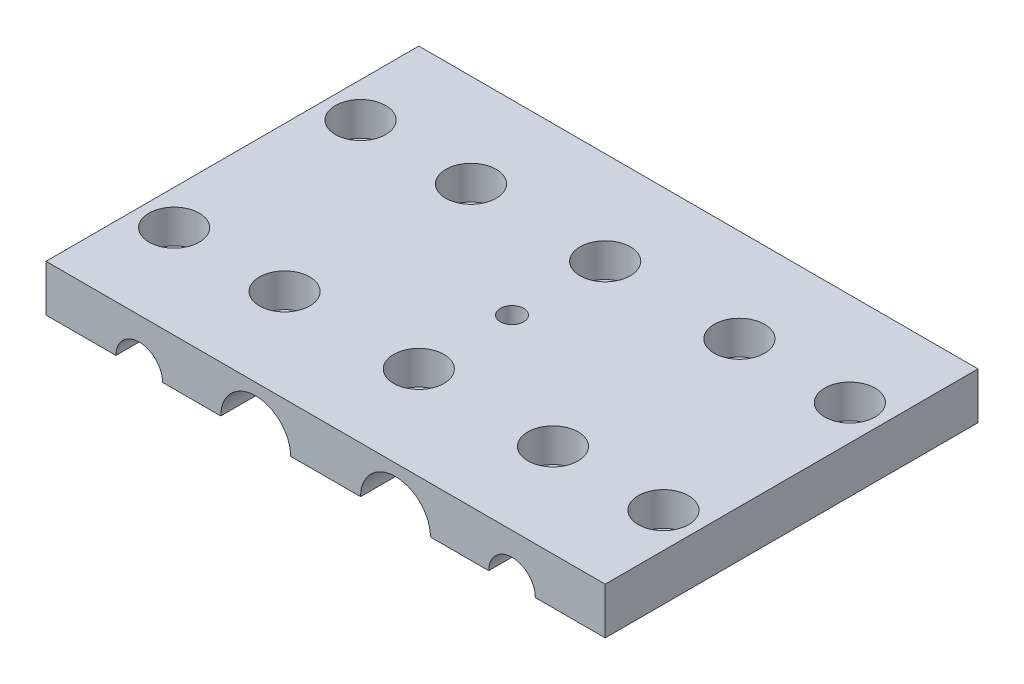
ISO-10303-21;
HEADER;
FILE_DESCRIPTION(('STEP AP214'),'2;1');
FILE_NAME('part.step','',(''),(''),'','','');
FILE_SCHEMA(('AUTOMOTIVE_DESIGN { 1 0 10303 214 1 1 1 1 }'));
ENDSEC;
DATA;
#1=APPLICATION_CONTEXT('core data for automotive mechanical design processes');
#2=APPLICATION_PROTOCOL_DEFINITION('international standard','automotive_design',2000,#1);
#3=PRODUCT_CONTEXT('',#1,'mechanical');
#4=PRODUCT('Part','Part','',(#3));
#5=PRODUCT_RELATED_PRODUCT_CATEGORY('part','',(#4));
#6=PRODUCT_DEFINITION_FORMATION('','',#4);
#7=PRODUCT_DEFINITION_CONTEXT('part definition',#1,'design');
#8=PRODUCT_DEFINITION('design','',#6,#7);
#9=PRODUCT_DEFINITION_SHAPE('','',#8);
#10=(LENGTH_UNIT() NAMED_UNIT(*) SI_UNIT(.MILLI.,.METRE.));
#11=(NAMED_UNIT(*) PLANE_ANGLE_UNIT() SI_UNIT($,.RADIAN.));
#12=(NAMED_UNIT(*) SI_UNIT($,.STERADIAN.) SOLID_ANGLE_UNIT());
#13=UNCERTAINTY_MEASURE_WITH_UNIT(LENGTH_MEASURE(1.E-05),#10,'distance_accuracy_value','');
#14=(GEOMETRIC_REPRESENTATION_CONTEXT(3) GLOBAL_UNCERTAINTY_ASSIGNED_CONTEXT((#13)) GLOBAL_UNIT_ASSIGNED_CONTEXT((#10,
#11,#12)) REPRESENTATION_CONTEXT('',''));
#15=CARTESIAN_POINT('',(0.,0.,0.));
#16=DIRECTION('',(0.,0.,1.));
#17=DIRECTION('',(1.,0.,0.));
#18=AXIS2_PLACEMENT_3D('',#15,#16,#17);
#19=CARTESIAN_POINT('',(-33.3375,6.35,12.7));
#20=DIRECTION('',(0.,1.,0.));
#21=DIRECTION('',(0.,0.,1.));
#22=AXIS2_PLACEMENT_3D('',#19,#20,#21);
#23=CYLINDRICAL_SURFACE('',#22,2.2479);
#24=CARTESIAN_POINT('',(-33.3375,0.,12.7));
#25=DIRECTION('',(0.,1.,0.));
#26=DIRECTION('',(0.,0.,1.));
#27=AXIS2_PLACEMENT_3D('',#24,#25,#26);
#28=CIRCLE('',#27,2.2479);
#29=CARTESIAN_POINT('',(-33.3375,0.,14.9479));
#30=VERTEX_POINT('',#29);
#31=EDGE_CURVE('E274',#30,#30,#28,.T.);
#32=ORIENTED_EDGE('',*,*,#31,.F.);
#33=EDGE_LOOP('',(#32));
#34=FACE_BOUND('',#33,.T.);
#35=CARTESIAN_POINT('',(-33.3375,1.778,12.7));
#36=DIRECTION('',(0.,1.,0.));
#37=DIRECTION('',(0.,0.,1.));
#38=AXIS2_PLACEMENT_3D('',#35,#36,#37);
#39=CIRCLE('',#38,2.2479);
#40=CARTESIAN_POINT('',(-33.3375,1.778,14.9479));
#41=VERTEX_POINT('',#40);
#42=EDGE_CURVE('E38',#41,#41,#39,.F.);
#43=ORIENTED_EDGE('',*,*,#42,.F.);
#44=EDGE_LOOP('',(#43));
#45=FACE_BOUND('',#44,.T.);
#46=ADVANCED_FACE('F34',(#34,#45),#23,.F.);
#47=CARTESIAN_POINT('',(-18.288,6.35,12.7));
#48=DIRECTION('',(0.,1.,0.));
#49=DIRECTION('',(0.,0.,1.));
#50=AXIS2_PLACEMENT_3D('',#47,#48,#49);
#51=CYLINDRICAL_SURFACE('',#50,2.2479);
#52=CARTESIAN_POINT('',(-18.288,0.,12.7));
#53=DIRECTION('',(0.,1.,0.));
#54=DIRECTION('',(0.,0.,1.));
#55=AXIS2_PLACEMENT_3D('',#52,#53,#54);
#56=CIRCLE('',#55,2.2479);
#57=CARTESIAN_POINT('',(-18.288,0.,14.9479));
#58=VERTEX_POINT('',#57);
#59=EDGE_CURVE('E277',#58,#58,#56,.T.);
#60=ORIENTED_EDGE('',*,*,#59,.F.);
#61=EDGE_LOOP('',(#60));
#62=FACE_BOUND('',#61,.T.);
#63=CARTESIAN_POINT('',(-18.288,1.778,12.7));
#64=DIRECTION('',(0.,1.,0.));
#65=DIRECTION('',(0.,0.,1.));
#66=AXIS2_PLACEMENT_3D('',#63,#64,#65);
#67=CIRCLE('',#66,2.2479);
#68=CARTESIAN_POINT('',(-18.288,1.778,14.9479));
#69=VERTEX_POINT('',#68);
#70=EDGE_CURVE('E223',#69,#69,#67,.F.);
#71=ORIENTED_EDGE('',*,*,#70,.F.);
#72=EDGE_LOOP('',(#71));
#73=FACE_BOUND('',#72,.T.);
#74=ADVANCED_FACE('F380',(#62,#73),#51,.F.);
#75=CARTESIAN_POINT('',(0.,6.35,12.7));
#76=DIRECTION('',(0.,1.,0.));
#77=DIRECTION('',(0.,0.,1.));
#78=AXIS2_PLACEMENT_3D('',#75,#76,#77);
#79=CYLINDRICAL_SURFACE('',#78,2.2479);
#80=CARTESIAN_POINT('',(0.,0.,12.7));
#81=DIRECTION('',(0.,1.,0.));
#82=DIRECTION('',(0.,0.,1.));
#83=AXIS2_PLACEMENT_3D('',#80,#81,#82);
#84=CIRCLE('',#83,2.2479);
#85=CARTESIAN_POINT('',(0.,0.,14.9479));
#86=VERTEX_POINT('',#85);
#87=EDGE_CURVE('E280',#86,#86,#84,.T.);
#88=ORIENTED_EDGE('',*,*,#87,.F.);
#89=EDGE_LOOP('',(#88));
#90=FACE_BOUND('',#89,.T.);
#91=CARTESIAN_POINT('',(0.,1.778,12.7));
#92=DIRECTION('',(0.,1.,0.));
#93=DIRECTION('',(0.,0.,1.));
#94=AXIS2_PLACEMENT_3D('',#91,#92,#93);
#95=CIRCLE('',#94,2.2479);
#96=CARTESIAN_POINT('',(0.,1.778,14.9479));
#97=VERTEX_POINT('',#96);
#98=EDGE_CURVE('E219',#97,#97,#95,.F.);
#99=ORIENTED_EDGE('',*,*,#98,.F.);
#100=EDGE_LOOP('',(#99));
#101=FACE_BOUND('',#100,.T.);
#102=ADVANCED_FACE('F386',(#90,#101),#79,.F.);
#103=CARTESIAN_POINT('',(18.288,6.35,12.7));
#104=DIRECTION('',(0.,1.,0.));
#105=DIRECTION('',(0.,0.,1.));
#106=AXIS2_PLACEMENT_3D('',#103,#104,#105);
#107=CYLINDRICAL_SURFACE('',#106,2.2479);
#108=CARTESIAN_POINT('',(18.288,0.,12.7));
#109=DIRECTION('',(0.,1.,0.));
#110=DIRECTION('',(0.,0.,1.));
#111=AXIS2_PLACEMENT_3D('',#108,#109,#110);
#112=CIRCLE('',#111,2.2479);
#113=CARTESIAN_POINT('',(18.288,0.,14.9479));
#114=VERTEX_POINT('',#113);
#115=EDGE_CURVE('E283',#114,#114,#112,.T.);
#116=ORIENTED_EDGE('',*,*,#115,.F.);
#117=EDGE_LOOP('',(#116));
#118=FACE_BOUND('',#117,.T.);
#119=CARTESIAN_POINT('',(18.288,1.778,12.7));
#120=DIRECTION('',(0.,1.,0.));
#121=DIRECTION('',(0.,0.,1.));
#122=AXIS2_PLACEMENT_3D('',#119,#120,#121);
#123=CIRCLE('',#122,2.2479);
#124=CARTESIAN_POINT('',(18.288,1.778,14.9479));
#125=VERTEX_POINT('',#124);
#126=EDGE_CURVE('E214',#125,#125,#123,.F.);
#127=ORIENTED_EDGE('',*,*,#126,.F.);
#128=EDGE_LOOP('',(#127));
#129=FACE_BOUND('',#128,.T.);
#130=ADVANCED_FACE('F397',(#118,#129),#107,.F.);
#131=CARTESIAN_POINT('',(33.3375,6.35,12.7));
#132=DIRECTION('',(0.,1.,0.));
#133=DIRECTION('',(0.,0.,1.));
#134=AXIS2_PLACEMENT_3D('',#131,#132,#133);
#135=CYLINDRICAL_SURFACE('',#134,2.2479);
#136=CARTESIAN_POINT('',(33.3375,0.,12.7));
#137=DIRECTION('',(0.,1.,0.));
#138=DIRECTION('',(0.,0.,1.));
#139=AXIS2_PLACEMENT_3D('',#136,#137,#138);
#140=CIRCLE('',#139,2.2479);
#141=CARTESIAN_POINT('',(33.3375,0.,14.9479));
#142=VERTEX_POINT('',#141);
#143=EDGE_CURVE('E286',#142,#142,#140,.T.);
#144=ORIENTED_EDGE('',*,*,#143,.F.);
#145=EDGE_LOOP('',(#144));
#146=FACE_BOUND('',#145,.T.);
#147=CARTESIAN_POINT('',(33.3375,1.778,12.7));
#148=DIRECTION('',(0.,1.,0.));
#149=DIRECTION('',(0.,0.,1.));
#150=AXIS2_PLACEMENT_3D('',#147,#148,#149);
#151=CIRCLE('',#150,2.2479);
#152=CARTESIAN_POINT('',(33.3375,1.778,14.9479));
#153=VERTEX_POINT('',#152);
#154=EDGE_CURVE('E209',#153,#153,#151,.F.);
#155=ORIENTED_EDGE('',*,*,#154,.F.);
#156=EDGE_LOOP('',(#155));
#157=FACE_BOUND('',#156,.T.);
#158=ADVANCED_FACE('F401',(#146,#157),#135,.F.);
#159=CARTESIAN_POINT('',(33.3375,6.35,-12.7));
#160=DIRECTION('',(0.,1.,0.));
#161=DIRECTION('',(0.,0.,1.));
#162=AXIS2_PLACEMENT_3D('',#159,#160,#161);
#163=CYLINDRICAL_SURFACE('',#162,2.2479);
#164=CARTESIAN_POINT('',(33.3375,0.,-12.7));
#165=DIRECTION('',(0.,1.,0.));
#166=DIRECTION('',(0.,0.,1.));
#167=AXIS2_PLACEMENT_3D('',#164,#165,#166);
#168=CIRCLE('',#167,2.2479);
#169=CARTESIAN_POINT('',(33.3375,0.,-10.4521));
#170=VERTEX_POINT('',#169);
#171=EDGE_CURVE('E289',#170,#170,#168,.T.);
#172=ORIENTED_EDGE('',*,*,#171,.F.);
#173=EDGE_LOOP('',(#172));
#174=FACE_BOUND('',#173,.T.);
#175=CARTESIAN_POINT('',(33.3375,1.778,-12.7));
#176=DIRECTION('',(0.,1.,0.));
#177=DIRECTION('',(0.,0.,1.));
#178=AXIS2_PLACEMENT_3D('',#175,#176,#177);
#179=CIRCLE('',#178,2.2479);
#180=CARTESIAN_POINT('',(33.3375,1.778,-10.4521));
#181=VERTEX_POINT('',#180);
#182=EDGE_CURVE('E204',#181,#181,#179,.F.);
#183=ORIENTED_EDGE('',*,*,#182,.F.);
#184=EDGE_LOOP('',(#183));
#185=FACE_BOUND('',#184,.T.);
#186=ADVANCED_FACE('F405',(#174,#185),#163,.F.);
#187=CARTESIAN_POINT('',(18.288,6.35,-12.7));
#188=DIRECTION('',(0.,1.,0.));
#189=DIRECTION('',(0.,0.,1.));
#190=AXIS2_PLACEMENT_3D('',#187,#188,#189);
#191=CYLINDRICAL_SURFACE('',#190,2.2479);
#192=CARTESIAN_POINT('',(18.288,0.,-12.7));
#193=DIRECTION('',(0.,1.,0.));
#194=DIRECTION('',(0.,0.,1.));
#195=AXIS2_PLACEMENT_3D('',#192,#193,#194);
#196=CIRCLE('',#195,2.2479);
#197=CARTESIAN_POINT('',(18.288,0.,-10.4521));
#198=VERTEX_POINT('',#197);
#199=EDGE_CURVE('E292',#198,#198,#196,.T.);
#200=ORIENTED_EDGE('',*,*,#199,.F.);
#201=EDGE_LOOP('',(#200));
#202=FACE_BOUND('',#201,.T.);
#203=CARTESIAN_POINT('',(18.288,1.778,-12.7));
#204=DIRECTION('',(0.,1.,0.));
#205=DIRECTION('',(0.,0.,1.));
#206=AXIS2_PLACEMENT_3D('',#203,#204,#205);
#207=CIRCLE('',#206,2.2479);
#208=CARTESIAN_POINT('',(18.288,1.778,-10.4521));
#209=VERTEX_POINT('',#208);
#210=EDGE_CURVE('E199',#209,#209,#207,.F.);
#211=ORIENTED_EDGE('',*,*,#210,.F.);
#212=EDGE_LOOP('',(#211));
#213=FACE_BOUND('',#212,.T.);
#214=ADVANCED_FACE('F409',(#202,#213),#191,.F.);
#215=CARTESIAN_POINT('',(0.,6.35,-12.7));
#216=DIRECTION('',(0.,1.,0.));
#217=DIRECTION('',(0.,0.,1.));
#218=AXIS2_PLACEMENT_3D('',#215,#216,#217);
#219=CYLINDRICAL_SURFACE('',#218,2.2479);
#220=CARTESIAN_POINT('',(0.,0.,-12.7));
#221=DIRECTION('',(0.,1.,0.));
#222=DIRECTION('',(0.,0.,1.));
#223=AXIS2_PLACEMENT_3D('',#220,#221,#222);
#224=CIRCLE('',#223,2.2479);
#225=CARTESIAN_POINT('',(0.,0.,-10.4521));
#226=VERTEX_POINT('',#225);
#227=EDGE_CURVE('E295',#226,#226,#224,.T.);
#228=ORIENTED_EDGE('',*,*,#227,.F.);
#229=EDGE_LOOP('',(#228));
#230=FACE_BOUND('',#229,.T.);
#231=CARTESIAN_POINT('',(0.,1.778,-12.7));
#232=DIRECTION('',(0.,1.,0.));
#233=DIRECTION('',(0.,0.,1.));
#234=AXIS2_PLACEMENT_3D('',#231,#232,#233);
#235=CIRCLE('',#234,2.2479);
#236=CARTESIAN_POINT('',(0.,1.778,-10.4521));
#237=VERTEX_POINT('',#236);
#238=EDGE_CURVE('E194',#237,#237,#235,.F.);
#239=ORIENTED_EDGE('',*,*,#238,.F.);
#240=EDGE_LOOP('',(#239));
#241=FACE_BOUND('',#240,.T.);
#242=ADVANCED_FACE('F413',(#230,#241),#219,.F.);
#243=CARTESIAN_POINT('',(-18.288,6.35,-12.7));
#244=DIRECTION('',(0.,1.,0.));
#245=DIRECTION('',(0.,0.,1.));
#246=AXIS2_PLACEMENT_3D('',#243,#244,#245);
#247=CYLINDRICAL_SURFACE('',#246,2.2479);
#248=CARTESIAN_POINT('',(-18.288,0.,-12.7));
#249=DIRECTION('',(0.,1.,0.));
#250=DIRECTION('',(0.,0.,1.));
#251=AXIS2_PLACEMENT_3D('',#248,#249,#250);
#252=CIRCLE('',#251,2.2479);
#253=CARTESIAN_POINT('',(-18.288,0.,-10.4521));
#254=VERTEX_POINT('',#253);
#255=EDGE_CURVE('E298',#254,#254,#252,.T.);
#256=ORIENTED_EDGE('',*,*,#255,.F.);
#257=EDGE_LOOP('',(#256));
#258=FACE_BOUND('',#257,.T.);
#259=CARTESIAN_POINT('',(-18.288,1.778,-12.7));
#260=DIRECTION('',(0.,1.,0.));
#261=DIRECTION('',(0.,0.,1.));
#262=AXIS2_PLACEMENT_3D('',#259,#260,#261);
#263=CIRCLE('',#262,2.2479);
#264=CARTESIAN_POINT('',(-18.288,1.778,-10.4521));
#265=VERTEX_POINT('',#264);
#266=EDGE_CURVE('E189',#265,#265,#263,.F.);
#267=ORIENTED_EDGE('',*,*,#266,.F.);
#268=EDGE_LOOP('',(#267));
#269=FACE_BOUND('',#268,.T.);
#270=ADVANCED_FACE('F417',(#258,#269),#247,.F.);
#271=CARTESIAN_POINT('',(-33.3375,6.35,-12.7));
#272=DIRECTION('',(0.,1.,0.));
#273=DIRECTION('',(0.,0.,1.));
#274=AXIS2_PLACEMENT_3D('',#271,#272,#273);
#275=CYLINDRICAL_SURFACE('',#274,2.2479);
#276=CARTESIAN_POINT('',(-33.3375,0.,-12.7));
#277=DIRECTION('',(0.,1.,0.));
#278=DIRECTION('',(0.,0.,1.));
#279=AXIS2_PLACEMENT_3D('',#276,#277,#278);
#280=CIRCLE('',#279,2.2479);
#281=CARTESIAN_POINT('',(-33.3375,0.,-10.4521));
#282=VERTEX_POINT('',#281);
#283=EDGE_CURVE('E187',#282,#282,#280,.T.);
#284=ORIENTED_EDGE('',*,*,#283,.F.);
#285=EDGE_LOOP('',(#284));
#286=FACE_BOUND('',#285,.T.);
#287=CARTESIAN_POINT('',(-33.3375,1.778,-12.7));
#288=DIRECTION('',(0.,1.,0.));
#289=DIRECTION('',(0.,0.,1.));
#290=AXIS2_PLACEMENT_3D('',#287,#288,#289);
#291=CIRCLE('',#290,2.2479);
#292=CARTESIAN_POINT('',(-33.3375,1.778,-10.4521));
#293=VERTEX_POINT('',#292);
#294=EDGE_CURVE('E184',#293,#293,#291,.F.);
#295=ORIENTED_EDGE('',*,*,#294,.F.);
#296=EDGE_LOOP('',(#295));
#297=FACE_BOUND('',#296,.T.);
#298=ADVANCED_FACE('F392',(#286,#297),#275,.F.);
#299=CARTESIAN_POINT('',(0.,0.,0.));
#300=DIRECTION('',(0.,1.,0.));
#301=DIRECTION('',(0.,0.,1.));
#302=AXIS2_PLACEMENT_3D('',#299,#300,#301);
#303=PLANE('',#302);
#304=CARTESIAN_POINT('',(0.,0.,0.));
#305=DIRECTION('',(0.,1.,0.));
#306=DIRECTION('',(0.,0.,1.));
#307=AXIS2_PLACEMENT_3D('',#304,#305,#306);
#308=CIRCLE('',#307,1.5875);
#309=CARTESIAN_POINT('',(0.,0.,1.5875));
#310=VERTEX_POINT('',#309);
#311=EDGE_CURVE('E813',#310,#310,#308,.T.);
#312=ORIENTED_EDGE('',*,*,#311,.T.);
#313=EDGE_LOOP('',(#312));
#314=FACE_BOUND('',#313,.T.);
#315=ORIENTED_EDGE('',*,*,#87,.T.);
#316=EDGE_LOOP('',(#315));
#317=FACE_BOUND('',#316,.T.);
#318=ORIENTED_EDGE('',*,*,#227,.T.);
#319=EDGE_LOOP('',(#318));
#320=FACE_BOUND('',#319,.T.);
#321=DIRECTION('',(-1.,0.,0.));
#322=VECTOR('',#321,1.);
#323=CARTESIAN_POINT('',(-38.1,0.,-25.4));
#324=LINE('',#323,#322);
#325=CARTESIAN_POINT('',(4.7625,0.,-25.4));
#326=VERTEX_POINT('',#325);
#327=CARTESIAN_POINT('',(-4.7625,0.,-25.4));
#328=VERTEX_POINT('',#327);
#329=EDGE_CURVE('E145',#326,#328,#324,.T.);
#330=ORIENTED_EDGE('',*,*,#329,.F.);
#331=DIRECTION('',(0.,0.,1.));
#332=VECTOR('',#331,1.);
#333=CARTESIAN_POINT('',(4.7625,0.,-25.4));
#334=LINE('',#333,#332);
#335=CARTESIAN_POINT('',(4.7625,0.,25.4));
#336=VERTEX_POINT('',#335);
#337=EDGE_CURVE('E51',#326,#336,#334,.T.);
#338=ORIENTED_EDGE('',*,*,#337,.T.);
#339=DIRECTION('',(1.,0.,0.));
#340=VECTOR('',#339,1.);
#341=CARTESIAN_POINT('',(-38.1,0.,25.4));
#342=LINE('',#341,#340);
#343=CARTESIAN_POINT('',(-4.7625,0.,25.4));
#344=VERTEX_POINT('',#343);
#345=EDGE_CURVE('E351',#344,#336,#342,.T.);
#346=ORIENTED_EDGE('',*,*,#345,.F.);
#347=DIRECTION('',(0.,0.,1.));
#348=VECTOR('',#347,1.);
#349=CARTESIAN_POINT('',(-4.7625,0.,-25.4));
#350=LINE('',#349,#348);
#351=EDGE_CURVE('E305',#344,#328,#350,.F.);
#352=ORIENTED_EDGE('',*,*,#351,.T.);
#353=EDGE_LOOP('',(#330,#338,#346,#352));
#354=FACE_BOUND('',#353,.T.);
#355=ADVANCED_FACE('F373',(#314,#317,#320,#354),#303,.F.);
#356=ORIENTED_EDGE('',*,*,#59,.T.);
#357=EDGE_LOOP('',(#356));
#358=FACE_BOUND('',#357,.T.);
#359=ORIENTED_EDGE('',*,*,#255,.T.);
#360=EDGE_LOOP('',(#359));
#361=FACE_BOUND('',#360,.T.);
#362=CARTESIAN_POINT('',(-14.2875,0.,-25.4));
#363=VERTEX_POINT('',#362);
#364=CARTESIAN_POINT('',(-22.225,0.,-25.4));
#365=VERTEX_POINT('',#364);
#366=EDGE_CURVE('E148',#363,#365,#324,.T.);
#367=ORIENTED_EDGE('',*,*,#366,.F.);
#368=DIRECTION('',(0.,0.,1.));
#369=VECTOR('',#368,1.);
#370=CARTESIAN_POINT('',(-14.2875,0.,-25.4));
#371=LINE('',#370,#369);
#372=CARTESIAN_POINT('',(-14.2875,0.,25.4));
#373=VERTEX_POINT('',#372);
#374=EDGE_CURVE('E59',#363,#373,#371,.T.);
#375=ORIENTED_EDGE('',*,*,#374,.T.);
#376=CARTESIAN_POINT('',(-22.225,0.,25.4));
#377=VERTEX_POINT('',#376);
#378=EDGE_CURVE('E173',#377,#373,#342,.T.);
#379=ORIENTED_EDGE('',*,*,#378,.F.);
#380=DIRECTION('',(0.,0.,1.));
#381=VECTOR('',#380,1.);
#382=CARTESIAN_POINT('',(-22.225,0.,-25.4));
#383=LINE('',#382,#381);
#384=EDGE_CURVE('E163',#377,#365,#383,.F.);
#385=ORIENTED_EDGE('',*,*,#384,.T.);
#386=EDGE_LOOP('',(#367,#375,#379,#385));
#387=FACE_BOUND('',#386,.T.);
#388=ADVANCED_FACE('F171',(#358,#361,#387),#303,.F.);
#389=ORIENTED_EDGE('',*,*,#115,.T.);
#390=EDGE_LOOP('',(#389));
#391=FACE_BOUND('',#390,.T.);
#392=ORIENTED_EDGE('',*,*,#199,.T.);
#393=EDGE_LOOP('',(#392));
#394=FACE_BOUND('',#393,.T.);
#395=CARTESIAN_POINT('',(14.2875,0.,25.4));
#396=VERTEX_POINT('',#395);
#397=CARTESIAN_POINT('',(22.225,0.,25.4));
#398=VERTEX_POINT('',#397);
#399=EDGE_CURVE('E138',#396,#398,#342,.T.);
#400=ORIENTED_EDGE('',*,*,#399,.F.);
#401=DIRECTION('',(0.,0.,1.));
#402=VECTOR('',#401,1.);
#403=CARTESIAN_POINT('',(14.2875,0.,-25.4));
#404=LINE('',#403,#402);
#405=CARTESIAN_POINT('',(14.2875,0.,-25.4));
#406=VERTEX_POINT('',#405);
#407=EDGE_CURVE('E126',#396,#406,#404,.F.);
#408=ORIENTED_EDGE('',*,*,#407,.T.);
#409=CARTESIAN_POINT('',(22.225,0.,-25.4));
#410=VERTEX_POINT('',#409);
#411=EDGE_CURVE('E137',#410,#406,#324,.T.);
#412=ORIENTED_EDGE('',*,*,#411,.F.);
#413=DIRECTION('',(0.,0.,1.));
#414=VECTOR('',#413,1.);
#415=CARTESIAN_POINT('',(22.225,0.,-25.4));
#416=LINE('',#415,#414);
#417=EDGE_CURVE('E11',#410,#398,#416,.T.);
#418=ORIENTED_EDGE('',*,*,#417,.T.);
#419=EDGE_LOOP('',(#400,#408,#412,#418));
#420=FACE_BOUND('',#419,.T.);
#421=ADVANCED_FACE('F136',(#391,#394,#420),#303,.F.);
#422=ORIENTED_EDGE('',*,*,#283,.T.);
#423=EDGE_LOOP('',(#422));
#424=FACE_BOUND('',#423,.T.);
#425=ORIENTED_EDGE('',*,*,#31,.T.);
#426=EDGE_LOOP('',(#425));
#427=FACE_BOUND('',#426,.T.);
#428=CARTESIAN_POINT('',(-28.575,0.,-25.4));
#429=VERTEX_POINT('',#428);
#430=CARTESIAN_POINT('',(-38.1,0.,-25.4));
#431=VERTEX_POINT('',#430);
#432=EDGE_CURVE('E147',#429,#431,#324,.T.);
#433=ORIENTED_EDGE('',*,*,#432,.F.);
#434=DIRECTION('',(0.,0.,1.));
#435=VECTOR('',#434,1.);
#436=CARTESIAN_POINT('',(-28.575,0.,-25.4));
#437=LINE('',#436,#435);
#438=CARTESIAN_POINT('',(-28.575,0.,25.4));
#439=VERTEX_POINT('',#438);
#440=EDGE_CURVE('E166',#429,#439,#437,.T.);
#441=ORIENTED_EDGE('',*,*,#440,.T.);
#442=CARTESIAN_POINT('',(-38.1,0.,25.4));
#443=VERTEX_POINT('',#442);
#444=EDGE_CURVE('E327',#443,#439,#342,.T.);
#445=ORIENTED_EDGE('',*,*,#444,.F.);
#446=DIRECTION('',(0.,0.,1.));
#447=VECTOR('',#446,1.);
#448=CARTESIAN_POINT('',(-38.1,0.,-25.4));
#449=LINE('',#448,#447);
#450=EDGE_CURVE('E167',#431,#443,#449,.T.);
#451=ORIENTED_EDGE('',*,*,#450,.F.);
#452=EDGE_LOOP('',(#433,#441,#445,#451));
#453=FACE_BOUND('',#452,.T.);
#454=ADVANCED_FACE('F355',(#424,#427,#453),#303,.F.);
#455=CARTESIAN_POINT('',(-38.1,6.35,-25.4));
#456=DIRECTION('',(1.,0.,0.));
#457=DIRECTION('',(0.,0.,-1.));
#458=AXIS2_PLACEMENT_3D('',#455,#456,#457);
#459=PLANE('',#458);
#460=ORIENTED_EDGE('',*,*,#450,.T.);
#461=DIRECTION('',(0.,-1.,0.));
#462=VECTOR('',#461,1.);
#463=CARTESIAN_POINT('',(-38.1,6.35,25.4));
#464=LINE('',#463,#462);
#465=CARTESIAN_POINT('',(-38.1,6.35,25.4));
#466=VERTEX_POINT('',#465);
#467=EDGE_CURVE('E174',#466,#443,#464,.T.);
#468=ORIENTED_EDGE('',*,*,#467,.F.);
#469=DIRECTION('',(0.,0.,1.));
#470=VECTOR('',#469,1.);
#471=CARTESIAN_POINT('',(-38.1,6.35,-25.4));
#472=LINE('',#471,#470);
#473=CARTESIAN_POINT('',(-38.1,6.35,-25.4));
#474=VERTEX_POINT('',#473);
#475=EDGE_CURVE('E149',#474,#466,#472,.T.);
#476=ORIENTED_EDGE('',*,*,#475,.F.);
#477=DIRECTION('',(0.,-1.,0.));
#478=VECTOR('',#477,1.);
#479=CARTESIAN_POINT('',(-38.1,6.35,-25.4));
#480=LINE('',#479,#478);
#481=EDGE_CURVE('E323',#474,#431,#480,.T.);
#482=ORIENTED_EDGE('',*,*,#481,.T.);
#483=EDGE_LOOP('',(#460,#468,#476,#482));
#484=FACE_BOUND('',#483,.T.);
#485=ADVANCED_FACE('F36',(#484),#459,.F.);
#486=CARTESIAN_POINT('',(-38.1,6.35,25.4));
#487=DIRECTION('',(0.,0.,-1.));
#488=DIRECTION('',(-1.,0.,0.));
#489=AXIS2_PLACEMENT_3D('',#486,#487,#488);
#490=PLANE('',#489);
#491=ORIENTED_EDGE('',*,*,#345,.T.);
#492=CARTESIAN_POINT('',(9.525,0.,25.4));
#493=DIRECTION('',(0.,0.,1.));
#494=DIRECTION('',(1.,0.,0.));
#495=AXIS2_PLACEMENT_3D('',#492,#493,#494);
#496=CIRCLE('',#495,4.7625);
#497=EDGE_CURVE('E131',#396,#336,#496,.T.);
#498=ORIENTED_EDGE('',*,*,#497,.F.);
#499=ORIENTED_EDGE('',*,*,#399,.T.);
#500=CARTESIAN_POINT('',(25.4,0.,25.4));
#501=DIRECTION('',(0.,0.,1.));
#502=DIRECTION('',(1.,0.,0.));
#503=AXIS2_PLACEMENT_3D('',#500,#501,#502);
#504=CIRCLE('',#503,3.175);
#505=CARTESIAN_POINT('',(28.575,0.,25.4));
#506=VERTEX_POINT('',#505);
#507=EDGE_CURVE('E310',#506,#398,#504,.T.);
#508=ORIENTED_EDGE('',*,*,#507,.F.);
#509=CARTESIAN_POINT('',(38.1,0.,25.4));
#510=VERTEX_POINT('',#509);
#511=EDGE_CURVE('E326',#506,#510,#342,.T.);
#512=ORIENTED_EDGE('',*,*,#511,.T.);
#513=DIRECTION('',(0.,-1.,0.));
#514=VECTOR('',#513,1.);
#515=CARTESIAN_POINT('',(38.1,6.35,25.4));
#516=LINE('',#515,#514);
#517=CARTESIAN_POINT('',(38.1,6.35,25.4));
#518=VERTEX_POINT('',#517);
#519=EDGE_CURVE('E178',#518,#510,#516,.T.);
#520=ORIENTED_EDGE('',*,*,#519,.F.);
#521=DIRECTION('',(1.,0.,0.));
#522=VECTOR('',#521,1.);
#523=CARTESIAN_POINT('',(-38.1,6.35,25.4));
#524=LINE('',#523,#522);
#525=EDGE_CURVE('E317',#466,#518,#524,.T.);
#526=ORIENTED_EDGE('',*,*,#525,.F.);
#527=ORIENTED_EDGE('',*,*,#467,.T.);
#528=ORIENTED_EDGE('',*,*,#444,.T.);
#529=CARTESIAN_POINT('',(-25.4,0.,25.4));
#530=DIRECTION('',(0.,0.,1.));
#531=DIRECTION('',(1.,0.,0.));
#532=AXIS2_PLACEMENT_3D('',#529,#530,#531);
#533=CIRCLE('',#532,3.175);
#534=EDGE_CURVE('E168',#377,#439,#533,.T.);
#535=ORIENTED_EDGE('',*,*,#534,.F.);
#536=ORIENTED_EDGE('',*,*,#378,.T.);
#537=CARTESIAN_POINT('',(-9.525,0.,25.4));
#538=DIRECTION('',(0.,0.,1.));
#539=DIRECTION('',(1.,0.,0.));
#540=AXIS2_PLACEMENT_3D('',#537,#538,#539);
#541=CIRCLE('',#540,4.7625);
#542=EDGE_CURVE('E303',#344,#373,#541,.T.);
#543=ORIENTED_EDGE('',*,*,#542,.F.);
#544=EDGE_LOOP('',(#491,#498,#499,#508,#512,#520,#526,#527,#528,#535,#536,#543));
#545=FACE_BOUND('',#544,.T.);
#546=ADVANCED_FACE('F350',(#545),#490,.F.);
#547=CARTESIAN_POINT('',(38.1,6.35,-25.4));
#548=DIRECTION('',(-1.,0.,0.));
#549=DIRECTION('',(0.,0.,1.));
#550=AXIS2_PLACEMENT_3D('',#547,#548,#549);
#551=PLANE('',#550);
#552=DIRECTION('',(0.,0.,-1.));
#553=VECTOR('',#552,1.);
#554=CARTESIAN_POINT('',(38.1,0.,-25.4));
#555=LINE('',#554,#553);
#556=CARTESIAN_POINT('',(38.1,0.,-25.4));
#557=VERTEX_POINT('',#556);
#558=EDGE_CURVE('E152',#510,#557,#555,.T.);
#559=ORIENTED_EDGE('',*,*,#558,.T.);
#560=DIRECTION('',(0.,-1.,0.));
#561=VECTOR('',#560,1.);
#562=CARTESIAN_POINT('',(38.1,6.35,-25.4));
#563=LINE('',#562,#561);
#564=CARTESIAN_POINT('',(38.1,6.35,-25.4));
#565=VERTEX_POINT('',#564);
#566=EDGE_CURVE('E336',#565,#557,#563,.T.);
#567=ORIENTED_EDGE('',*,*,#566,.F.);
#568=DIRECTION('',(0.,0.,-1.));
#569=VECTOR('',#568,1.);
#570=CARTESIAN_POINT('',(38.1,6.35,-25.4));
#571=LINE('',#570,#569);
#572=EDGE_CURVE('E319',#518,#565,#571,.T.);
#573=ORIENTED_EDGE('',*,*,#572,.F.);
#574=ORIENTED_EDGE('',*,*,#519,.T.);
#575=EDGE_LOOP('',(#559,#567,#573,#574));
#576=FACE_BOUND('',#575,.T.);
#577=ADVANCED_FACE('F334',(#576),#551,.F.);
#578=CARTESIAN_POINT('',(-38.1,6.35,-25.4));
#579=DIRECTION('',(0.,0.,1.));
#580=DIRECTION('',(1.,0.,0.));
#581=AXIS2_PLACEMENT_3D('',#578,#579,#580);
#582=PLANE('',#581);
#583=ORIENTED_EDGE('',*,*,#411,.T.);
#584=CARTESIAN_POINT('',(9.525,0.,-25.4));
#585=DIRECTION('',(0.,0.,1.));
#586=DIRECTION('',(1.,0.,0.));
#587=AXIS2_PLACEMENT_3D('',#584,#585,#586);
#588=CIRCLE('',#587,4.7625);
#589=EDGE_CURVE('E123',#406,#326,#588,.T.);
#590=ORIENTED_EDGE('',*,*,#589,.T.);
#591=ORIENTED_EDGE('',*,*,#329,.T.);
#592=CARTESIAN_POINT('',(-9.525,0.,-25.4));
#593=DIRECTION('',(0.,0.,1.));
#594=DIRECTION('',(1.,0.,0.));
#595=AXIS2_PLACEMENT_3D('',#592,#593,#594);
#596=CIRCLE('',#595,4.7625);
#597=EDGE_CURVE('E158',#328,#363,#596,.T.);
#598=ORIENTED_EDGE('',*,*,#597,.T.);
#599=ORIENTED_EDGE('',*,*,#366,.T.);
#600=CARTESIAN_POINT('',(-25.4,0.,-25.4));
#601=DIRECTION('',(0.,0.,1.));
#602=DIRECTION('',(1.,0.,0.));
#603=AXIS2_PLACEMENT_3D('',#600,#601,#602);
#604=CIRCLE('',#603,3.175);
#605=EDGE_CURVE('E156',#365,#429,#604,.T.);
#606=ORIENTED_EDGE('',*,*,#605,.T.);
#607=ORIENTED_EDGE('',*,*,#432,.T.);
#608=ORIENTED_EDGE('',*,*,#481,.F.);
#609=DIRECTION('',(-1.,0.,0.));
#610=VECTOR('',#609,1.);
#611=CARTESIAN_POINT('',(-38.1,6.35,-25.4));
#612=LINE('',#611,#610);
#613=EDGE_CURVE('E321',#565,#474,#612,.T.);
#614=ORIENTED_EDGE('',*,*,#613,.F.);
#615=ORIENTED_EDGE('',*,*,#566,.T.);
#616=CARTESIAN_POINT('',(28.575,0.,-25.4));
#617=VERTEX_POINT('',#616);
#618=EDGE_CURVE('E144',#557,#617,#324,.T.);
#619=ORIENTED_EDGE('',*,*,#618,.T.);
#620=CARTESIAN_POINT('',(25.4,0.,-25.4));
#621=DIRECTION('',(0.,0.,1.));
#622=DIRECTION('',(1.,0.,0.));
#623=AXIS2_PLACEMENT_3D('',#620,#621,#622);
#624=CIRCLE('',#623,3.175);
#625=EDGE_CURVE('E143',#617,#410,#624,.T.);
#626=ORIENTED_EDGE('',*,*,#625,.T.);
#627=EDGE_LOOP('',(#583,#590,#591,#598,#599,#606,#607,#608,#614,#615,#619,#626));
#628=FACE_BOUND('',#627,.T.);
#629=ADVANCED_FACE('F141',(#628),#582,.F.);
#630=CARTESIAN_POINT('',(0.,6.35,0.));
#631=DIRECTION('',(0.,1.,0.));
#632=DIRECTION('',(0.,0.,1.));
#633=AXIS2_PLACEMENT_3D('',#630,#631,#632);
#634=PLANE('',#633);
#635=CARTESIAN_POINT('',(0.,6.35,0.));
#636=DIRECTION('',(0.,1.,0.));
#637=DIRECTION('',(0.,0.,1.));
#638=AXIS2_PLACEMENT_3D('',#635,#636,#637);
#639=CIRCLE('',#638,1.5875);
#640=CARTESIAN_POINT('',(0.,6.35,1.5875));
#641=VERTEX_POINT('',#640);
#642=EDGE_CURVE('E824',#641,#641,#639,.T.);
#643=ORIENTED_EDGE('',*,*,#642,.F.);
#644=EDGE_LOOP('',(#643));
#645=FACE_BOUND('',#644,.T.);
#646=CARTESIAN_POINT('',(-33.3375,6.35,12.7));
#647=DIRECTION('',(0.,1.,0.));
#648=DIRECTION('',(0.,0.,1.));
#649=AXIS2_PLACEMENT_3D('',#646,#647,#648);
#650=CIRCLE('',#649,3.429);
#651=CARTESIAN_POINT('',(-33.3375,6.35,16.129));
#652=VERTEX_POINT('',#651);
#653=EDGE_CURVE('E239',#652,#652,#650,.T.);
#654=ORIENTED_EDGE('',*,*,#653,.F.);
#655=EDGE_LOOP('',(#654));
#656=FACE_BOUND('',#655,.T.);
#657=CARTESIAN_POINT('',(-18.288,6.35,12.7));
#658=DIRECTION('',(0.,1.,0.));
#659=DIRECTION('',(0.,0.,1.));
#660=AXIS2_PLACEMENT_3D('',#657,#658,#659);
#661=CIRCLE('',#660,3.429);
#662=CARTESIAN_POINT('',(-18.288,6.35,16.129));
#663=VERTEX_POINT('',#662);
#664=EDGE_CURVE('E232',#663,#663,#661,.T.);
#665=ORIENTED_EDGE('',*,*,#664,.F.);
#666=EDGE_LOOP('',(#665));
#667=FACE_BOUND('',#666,.T.);
#668=CARTESIAN_POINT('',(0.,6.35,12.7));
#669=DIRECTION('',(0.,1.,0.));
#670=DIRECTION('',(0.,0.,1.));
#671=AXIS2_PLACEMENT_3D('',#668,#669,#670);
#672=CIRCLE('',#671,3.429);
#673=CARTESIAN_POINT('',(0.,6.35,16.129));
#674=VERTEX_POINT('',#673);
#675=EDGE_CURVE('E225',#674,#674,#672,.T.);
#676=ORIENTED_EDGE('',*,*,#675,.F.);
#677=EDGE_LOOP('',(#676));
#678=FACE_BOUND('',#677,.T.);
#679=CARTESIAN_POINT('',(18.288,6.35,12.7));
#680=DIRECTION('',(0.,1.,0.));
#681=DIRECTION('',(0.,0.,1.));
#682=AXIS2_PLACEMENT_3D('',#679,#680,#681);
#683=CIRCLE('',#682,3.429);
#684=CARTESIAN_POINT('',(18.288,6.35,16.129));
#685=VERTEX_POINT('',#684);
#686=EDGE_CURVE('E221',#685,#685,#683,.T.);
#687=ORIENTED_EDGE('',*,*,#686,.F.);
#688=EDGE_LOOP('',(#687));
#689=FACE_BOUND('',#688,.T.);
#690=CARTESIAN_POINT('',(33.3375,6.35,12.7));
#691=DIRECTION('',(0.,1.,0.));
#692=DIRECTION('',(0.,0.,1.));
#693=AXIS2_PLACEMENT_3D('',#690,#691,#692);
#694=CIRCLE('',#693,3.429);
#695=CARTESIAN_POINT('',(33.3375,6.35,16.129));
#696=VERTEX_POINT('',#695);
#697=EDGE_CURVE('E217',#696,#696,#694,.T.);
#698=ORIENTED_EDGE('',*,*,#697,.F.);
#699=EDGE_LOOP('',(#698));
#700=FACE_BOUND('',#699,.T.);
#701=CARTESIAN_POINT('',(33.3375,6.35,-12.7));
#702=DIRECTION('',(0.,1.,0.));
#703=DIRECTION('',(0.,0.,1.));
#704=AXIS2_PLACEMENT_3D('',#701,#702,#703);
#705=CIRCLE('',#704,3.429);
#706=CARTESIAN_POINT('',(33.3375,6.35,-9.271));
#707=VERTEX_POINT('',#706);
#708=EDGE_CURVE('E212',#707,#707,#705,.T.);
#709=ORIENTED_EDGE('',*,*,#708,.F.);
#710=EDGE_LOOP('',(#709));
#711=FACE_BOUND('',#710,.T.);
#712=CARTESIAN_POINT('',(18.288,6.35,-12.7));
#713=DIRECTION('',(0.,1.,0.));
#714=DIRECTION('',(0.,0.,1.));
#715=AXIS2_PLACEMENT_3D('',#712,#713,#714);
#716=CIRCLE('',#715,3.429);
#717=CARTESIAN_POINT('',(18.288,6.35,-9.271));
#718=VERTEX_POINT('',#717);
#719=EDGE_CURVE('E207',#718,#718,#716,.T.);
#720=ORIENTED_EDGE('',*,*,#719,.F.);
#721=EDGE_LOOP('',(#720));
#722=FACE_BOUND('',#721,.T.);
#723=CARTESIAN_POINT('',(0.,6.35,-12.7));
#724=DIRECTION('',(0.,1.,0.));
#725=DIRECTION('',(0.,0.,1.));
#726=AXIS2_PLACEMENT_3D('',#723,#724,#725);
#727=CIRCLE('',#726,3.429);
#728=CARTESIAN_POINT('',(0.,6.35,-9.271));
#729=VERTEX_POINT('',#728);
#730=EDGE_CURVE('E202',#729,#729,#727,.T.);
#731=ORIENTED_EDGE('',*,*,#730,.F.);
#732=EDGE_LOOP('',(#731));
#733=FACE_BOUND('',#732,.T.);
#734=CARTESIAN_POINT('',(-18.288,6.35,-12.7));
#735=DIRECTION('',(0.,1.,0.));
#736=DIRECTION('',(0.,0.,1.));
#737=AXIS2_PLACEMENT_3D('',#734,#735,#736);
#738=CIRCLE('',#737,3.429);
#739=CARTESIAN_POINT('',(-18.288,6.35,-9.271));
#740=VERTEX_POINT('',#739);
#741=EDGE_CURVE('E197',#740,#740,#738,.T.);
#742=ORIENTED_EDGE('',*,*,#741,.F.);
#743=EDGE_LOOP('',(#742));
#744=FACE_BOUND('',#743,.T.);
#745=CARTESIAN_POINT('',(-33.3375,6.35,-12.7));
#746=DIRECTION('',(0.,1.,0.));
#747=DIRECTION('',(0.,0.,1.));
#748=AXIS2_PLACEMENT_3D('',#745,#746,#747);
#749=CIRCLE('',#748,3.429);
#750=CARTESIAN_POINT('',(-33.3375,6.35,-9.271));
#751=VERTEX_POINT('',#750);
#752=EDGE_CURVE('E192',#751,#751,#749,.T.);
#753=ORIENTED_EDGE('',*,*,#752,.F.);
#754=EDGE_LOOP('',(#753));
#755=FACE_BOUND('',#754,.T.);
#756=ORIENTED_EDGE('',*,*,#475,.T.);
#757=ORIENTED_EDGE('',*,*,#525,.T.);
#758=ORIENTED_EDGE('',*,*,#572,.T.);
#759=ORIENTED_EDGE('',*,*,#613,.T.);
#760=EDGE_LOOP('',(#756,#757,#758,#759));
#761=FACE_BOUND('',#760,.T.);
#762=ADVANCED_FACE('F362',(#645,#656,#667,#678,#689,#700,#711,#722,#733,#744,#755,#761),#634,.T.);
#763=ORIENTED_EDGE('',*,*,#143,.T.);
#764=EDGE_LOOP('',(#763));
#765=FACE_BOUND('',#764,.T.);
#766=ORIENTED_EDGE('',*,*,#171,.T.);
#767=EDGE_LOOP('',(#766));
#768=FACE_BOUND('',#767,.T.);
#769=ORIENTED_EDGE('',*,*,#511,.F.);
#770=DIRECTION('',(0.,0.,1.));
#771=VECTOR('',#770,1.);
#772=CARTESIAN_POINT('',(28.575,0.,-25.4));
#773=LINE('',#772,#771);
#774=EDGE_CURVE('E43',#506,#617,#773,.F.);
#775=ORIENTED_EDGE('',*,*,#774,.T.);
#776=ORIENTED_EDGE('',*,*,#618,.F.);
#777=ORIENTED_EDGE('',*,*,#558,.F.);
#778=EDGE_LOOP('',(#769,#775,#776,#777));
#779=FACE_BOUND('',#778,.T.);
#780=ADVANCED_FACE('F344',(#765,#768,#779),#303,.F.);
#781=CARTESIAN_POINT('',(-25.4,0.,-25.4));
#782=DIRECTION('',(0.,0.,1.));
#783=DIRECTION('',(1.,0.,0.));
#784=AXIS2_PLACEMENT_3D('',#781,#782,#783);
#785=CYLINDRICAL_SURFACE('',#784,3.175);
#786=ORIENTED_EDGE('',*,*,#605,.F.);
#787=ORIENTED_EDGE('',*,*,#384,.F.);
#788=ORIENTED_EDGE('',*,*,#534,.T.);
#789=ORIENTED_EDGE('',*,*,#440,.F.);
#790=EDGE_LOOP('',(#786,#787,#788,#789));
#791=FACE_BOUND('',#790,.T.);
#792=ADVANCED_FACE('F162',(#791),#785,.F.);
#793=CARTESIAN_POINT('',(25.4,0.,-25.4));
#794=DIRECTION('',(0.,0.,1.));
#795=DIRECTION('',(1.,0.,0.));
#796=AXIS2_PLACEMENT_3D('',#793,#794,#795);
#797=CYLINDRICAL_SURFACE('',#796,3.175);
#798=ORIENTED_EDGE('',*,*,#625,.F.);
#799=ORIENTED_EDGE('',*,*,#774,.F.);
#800=ORIENTED_EDGE('',*,*,#507,.T.);
#801=ORIENTED_EDGE('',*,*,#417,.F.);
#802=EDGE_LOOP('',(#798,#799,#800,#801));
#803=FACE_BOUND('',#802,.T.);
#804=ADVANCED_FACE('F347',(#803),#797,.F.);
#805=CARTESIAN_POINT('',(-9.525,0.,-25.4));
#806=DIRECTION('',(0.,0.,1.));
#807=DIRECTION('',(1.,0.,0.));
#808=AXIS2_PLACEMENT_3D('',#805,#806,#807);
#809=CYLINDRICAL_SURFACE('',#808,4.7625);
#810=ORIENTED_EDGE('',*,*,#597,.F.);
#811=ORIENTED_EDGE('',*,*,#351,.F.);
#812=ORIENTED_EDGE('',*,*,#542,.T.);
#813=ORIENTED_EDGE('',*,*,#374,.F.);
#814=EDGE_LOOP('',(#810,#811,#812,#813));
#815=FACE_BOUND('',#814,.T.);
#816=ADVANCED_FACE('F425',(#815),#809,.F.);
#817=CARTESIAN_POINT('',(9.525,0.,-25.4));
#818=DIRECTION('',(0.,0.,1.));
#819=DIRECTION('',(1.,0.,0.));
#820=AXIS2_PLACEMENT_3D('',#817,#818,#819);
#821=CYLINDRICAL_SURFACE('',#820,4.7625);
#822=ORIENTED_EDGE('',*,*,#589,.F.);
#823=ORIENTED_EDGE('',*,*,#407,.F.);
#824=ORIENTED_EDGE('',*,*,#497,.T.);
#825=ORIENTED_EDGE('',*,*,#337,.F.);
#826=EDGE_LOOP('',(#822,#823,#824,#825));
#827=FACE_BOUND('',#826,.T.);
#828=ADVANCED_FACE('F125',(#827),#821,.F.);
#829=CARTESIAN_POINT('',(-33.3375,1.778,-12.7));
#830=DIRECTION('',(0.,1.,0.));
#831=DIRECTION('',(0.,0.,1.));
#832=AXIS2_PLACEMENT_3D('',#829,#830,#831);
#833=PLANE('',#832);
#834=CARTESIAN_POINT('',(-33.3375,1.778,-12.7));
#835=DIRECTION('',(0.,1.,0.));
#836=DIRECTION('',(0.,0.,1.));
#837=AXIS2_PLACEMENT_3D('',#834,#835,#836);
#838=CIRCLE('',#837,3.429);
#839=CARTESIAN_POINT('',(-33.3375,1.778,-9.271));
#840=VERTEX_POINT('',#839);
#841=EDGE_CURVE('E188',#840,#840,#838,.T.);
#842=ORIENTED_EDGE('',*,*,#841,.T.);
#843=EDGE_LOOP('',(#842));
#844=FACE_BOUND('',#843,.T.);
#845=ORIENTED_EDGE('',*,*,#294,.T.);
#846=EDGE_LOOP('',(#845));
#847=FACE_BOUND('',#846,.T.);
#848=ADVANCED_FACE('F424',(#844,#847),#833,.T.);
#849=CARTESIAN_POINT('',(-33.3375,1.778,-12.7));
#850=DIRECTION('',(0.,1.,0.));
#851=DIRECTION('',(0.,0.,1.));
#852=AXIS2_PLACEMENT_3D('',#849,#850,#851);
#853=CYLINDRICAL_SURFACE('',#852,3.429);
#854=ORIENTED_EDGE('',*,*,#841,.F.);
#855=EDGE_LOOP('',(#854));
#856=FACE_BOUND('',#855,.T.);
#857=ORIENTED_EDGE('',*,*,#752,.T.);
#858=EDGE_LOOP('',(#857));
#859=FACE_BOUND('',#858,.T.);
#860=ADVANCED_FACE('F456',(#856,#859),#853,.F.);
#861=CARTESIAN_POINT('',(-18.288,1.778,-12.7));
#862=DIRECTION('',(0.,1.,0.));
#863=DIRECTION('',(0.,0.,1.));
#864=AXIS2_PLACEMENT_3D('',#861,#862,#863);
#865=PLANE('',#864);
#866=CARTESIAN_POINT('',(-18.288,1.778,-12.7));
#867=DIRECTION('',(0.,1.,0.));
#868=DIRECTION('',(0.,0.,1.));
#869=AXIS2_PLACEMENT_3D('',#866,#867,#868);
#870=CIRCLE('',#869,3.429);
#871=CARTESIAN_POINT('',(-18.288,1.778,-9.271));
#872=VERTEX_POINT('',#871);
#873=EDGE_CURVE('E193',#872,#872,#870,.T.);
#874=ORIENTED_EDGE('',*,*,#873,.T.);
#875=EDGE_LOOP('',(#874));
#876=FACE_BOUND('',#875,.T.);
#877=ORIENTED_EDGE('',*,*,#266,.T.);
#878=EDGE_LOOP('',(#877));
#879=FACE_BOUND('',#878,.T.);
#880=ADVANCED_FACE('F465',(#876,#879),#865,.T.);
#881=CARTESIAN_POINT('',(-18.288,1.778,-12.7));
#882=DIRECTION('',(0.,1.,0.));
#883=DIRECTION('',(0.,0.,1.));
#884=AXIS2_PLACEMENT_3D('',#881,#882,#883);
#885=CYLINDRICAL_SURFACE('',#884,3.429);
#886=ORIENTED_EDGE('',*,*,#873,.F.);
#887=EDGE_LOOP('',(#886));
#888=FACE_BOUND('',#887,.T.);
#889=ORIENTED_EDGE('',*,*,#741,.T.);
#890=EDGE_LOOP('',(#889));
#891=FACE_BOUND('',#890,.T.);
#892=ADVANCED_FACE('F472',(#888,#891),#885,.F.);
#893=CARTESIAN_POINT('',(0.,1.778,-12.7));
#894=DIRECTION('',(0.,1.,0.));
#895=DIRECTION('',(0.,0.,1.));
#896=AXIS2_PLACEMENT_3D('',#893,#894,#895);
#897=PLANE('',#896);
#898=CARTESIAN_POINT('',(0.,1.778,-12.7));
#899=DIRECTION('',(0.,1.,0.));
#900=DIRECTION('',(0.,0.,1.));
#901=AXIS2_PLACEMENT_3D('',#898,#899,#900);
#902=CIRCLE('',#901,3.429);
#903=CARTESIAN_POINT('',(0.,1.778,-9.271));
#904=VERTEX_POINT('',#903);
#905=EDGE_CURVE('E198',#904,#904,#902,.T.);
#906=ORIENTED_EDGE('',*,*,#905,.T.);
#907=EDGE_LOOP('',(#906));
#908=FACE_BOUND('',#907,.T.);
#909=ORIENTED_EDGE('',*,*,#238,.T.);
#910=EDGE_LOOP('',(#909));
#911=FACE_BOUND('',#910,.T.);
#912=ADVANCED_FACE('F480',(#908,#911),#897,.T.);
#913=CARTESIAN_POINT('',(0.,1.778,-12.7));
#914=DIRECTION('',(0.,1.,0.));
#915=DIRECTION('',(0.,0.,1.));
#916=AXIS2_PLACEMENT_3D('',#913,#914,#915);
#917=CYLINDRICAL_SURFACE('',#916,3.429);
#918=ORIENTED_EDGE('',*,*,#905,.F.);
#919=EDGE_LOOP('',(#918));
#920=FACE_BOUND('',#919,.T.);
#921=ORIENTED_EDGE('',*,*,#730,.T.);
#922=EDGE_LOOP('',(#921));
#923=FACE_BOUND('',#922,.T.);
#924=ADVANCED_FACE('F488',(#920,#923),#917,.F.);
#925=CARTESIAN_POINT('',(18.288,1.778,-12.7));
#926=DIRECTION('',(0.,1.,0.));
#927=DIRECTION('',(0.,0.,1.));
#928=AXIS2_PLACEMENT_3D('',#925,#926,#927);
#929=PLANE('',#928);
#930=CARTESIAN_POINT('',(18.288,1.778,-12.7));
#931=DIRECTION('',(0.,1.,0.));
#932=DIRECTION('',(0.,0.,1.));
#933=AXIS2_PLACEMENT_3D('',#930,#931,#932);
#934=CIRCLE('',#933,3.429);
#935=CARTESIAN_POINT('',(18.288,1.778,-9.271));
#936=VERTEX_POINT('',#935);
#937=EDGE_CURVE('E203',#936,#936,#934,.T.);
#938=ORIENTED_EDGE('',*,*,#937,.T.);
#939=EDGE_LOOP('',(#938));
#940=FACE_BOUND('',#939,.T.);
#941=ORIENTED_EDGE('',*,*,#210,.T.);
#942=EDGE_LOOP('',(#941));
#943=FACE_BOUND('',#942,.T.);
#944=ADVANCED_FACE('F496',(#940,#943),#929,.T.);
#945=CARTESIAN_POINT('',(18.288,1.778,-12.7));
#946=DIRECTION('',(0.,1.,0.));
#947=DIRECTION('',(0.,0.,1.));
#948=AXIS2_PLACEMENT_3D('',#945,#946,#947);
#949=CYLINDRICAL_SURFACE('',#948,3.429);
#950=ORIENTED_EDGE('',*,*,#937,.F.);
#951=EDGE_LOOP('',(#950));
#952=FACE_BOUND('',#951,.T.);
#953=ORIENTED_EDGE('',*,*,#719,.T.);
#954=EDGE_LOOP('',(#953));
#955=FACE_BOUND('',#954,.T.);
#956=ADVANCED_FACE('F504',(#952,#955),#949,.F.);
#957=CARTESIAN_POINT('',(33.3375,1.778,-12.7));
#958=DIRECTION('',(0.,1.,0.));
#959=DIRECTION('',(0.,0.,1.));
#960=AXIS2_PLACEMENT_3D('',#957,#958,#959);
#961=PLANE('',#960);
#962=CARTESIAN_POINT('',(33.3375,1.778,-12.7));
#963=DIRECTION('',(0.,1.,0.));
#964=DIRECTION('',(0.,0.,1.));
#965=AXIS2_PLACEMENT_3D('',#962,#963,#964);
#966=CIRCLE('',#965,3.429);
#967=CARTESIAN_POINT('',(33.3375,1.778,-9.271));
#968=VERTEX_POINT('',#967);
#969=EDGE_CURVE('E208',#968,#968,#966,.T.);
#970=ORIENTED_EDGE('',*,*,#969,.T.);
#971=EDGE_LOOP('',(#970));
#972=FACE_BOUND('',#971,.T.);
#973=ORIENTED_EDGE('',*,*,#182,.T.);
#974=EDGE_LOOP('',(#973));
#975=FACE_BOUND('',#974,.T.);
#976=ADVANCED_FACE('F512',(#972,#975),#961,.T.);
#977=CARTESIAN_POINT('',(33.3375,1.778,-12.7));
#978=DIRECTION('',(0.,1.,0.));
#979=DIRECTION('',(0.,0.,1.));
#980=AXIS2_PLACEMENT_3D('',#977,#978,#979);
#981=CYLINDRICAL_SURFACE('',#980,3.429);
#982=ORIENTED_EDGE('',*,*,#969,.F.);
#983=EDGE_LOOP('',(#982));
#984=FACE_BOUND('',#983,.T.);
#985=ORIENTED_EDGE('',*,*,#708,.T.);
#986=EDGE_LOOP('',(#985));
#987=FACE_BOUND('',#986,.T.);
#988=ADVANCED_FACE('F520',(#984,#987),#981,.F.);
#989=CARTESIAN_POINT('',(33.3375,1.778,12.7));
#990=DIRECTION('',(0.,1.,0.));
#991=DIRECTION('',(0.,0.,1.));
#992=AXIS2_PLACEMENT_3D('',#989,#990,#991);
#993=PLANE('',#992);
#994=CARTESIAN_POINT('',(33.3375,1.778,12.7));
#995=DIRECTION('',(0.,1.,0.));
#996=DIRECTION('',(0.,0.,1.));
#997=AXIS2_PLACEMENT_3D('',#994,#995,#996);
#998=CIRCLE('',#997,3.429);
#999=CARTESIAN_POINT('',(33.3375,1.778,16.129));
#1000=VERTEX_POINT('',#999);
#1001=EDGE_CURVE('E213',#1000,#1000,#998,.T.);
#1002=ORIENTED_EDGE('',*,*,#1001,.T.);
#1003=EDGE_LOOP('',(#1002));
#1004=FACE_BOUND('',#1003,.T.);
#1005=ORIENTED_EDGE('',*,*,#154,.T.);
#1006=EDGE_LOOP('',(#1005));
#1007=FACE_BOUND('',#1006,.T.);
#1008=ADVANCED_FACE('F528',(#1004,#1007),#993,.T.);
#1009=CARTESIAN_POINT('',(33.3375,1.778,12.7));
#1010=DIRECTION('',(0.,1.,0.));
#1011=DIRECTION('',(0.,0.,1.));
#1012=AXIS2_PLACEMENT_3D('',#1009,#1010,#1011);
#1013=CYLINDRICAL_SURFACE('',#1012,3.429);
#1014=ORIENTED_EDGE('',*,*,#1001,.F.);
#1015=EDGE_LOOP('',(#1014));
#1016=FACE_BOUND('',#1015,.T.);
#1017=ORIENTED_EDGE('',*,*,#697,.T.);
#1018=EDGE_LOOP('',(#1017));
#1019=FACE_BOUND('',#1018,.T.);
#1020=ADVANCED_FACE('F536',(#1016,#1019),#1013,.F.);
#1021=CARTESIAN_POINT('',(18.288,1.778,12.7));
#1022=DIRECTION('',(0.,1.,0.));
#1023=DIRECTION('',(0.,0.,1.));
#1024=AXIS2_PLACEMENT_3D('',#1021,#1022,#1023);
#1025=PLANE('',#1024);
#1026=CARTESIAN_POINT('',(18.288,1.778,12.7));
#1027=DIRECTION('',(0.,1.,0.));
#1028=DIRECTION('',(0.,0.,1.));
#1029=AXIS2_PLACEMENT_3D('',#1026,#1027,#1028);
#1030=CIRCLE('',#1029,3.429);
#1031=CARTESIAN_POINT('',(18.288,1.778,16.129));
#1032=VERTEX_POINT('',#1031);
#1033=EDGE_CURVE('E218',#1032,#1032,#1030,.T.);
#1034=ORIENTED_EDGE('',*,*,#1033,.T.);
#1035=EDGE_LOOP('',(#1034));
#1036=FACE_BOUND('',#1035,.T.);
#1037=ORIENTED_EDGE('',*,*,#126,.T.);
#1038=EDGE_LOOP('',(#1037));
#1039=FACE_BOUND('',#1038,.T.);
#1040=ADVANCED_FACE('F544',(#1036,#1039),#1025,.T.);
#1041=CARTESIAN_POINT('',(18.288,1.778,12.7));
#1042=DIRECTION('',(0.,1.,0.));
#1043=DIRECTION('',(0.,0.,1.));
#1044=AXIS2_PLACEMENT_3D('',#1041,#1042,#1043);
#1045=CYLINDRICAL_SURFACE('',#1044,3.429);
#1046=ORIENTED_EDGE('',*,*,#1033,.F.);
#1047=EDGE_LOOP('',(#1046));
#1048=FACE_BOUND('',#1047,.T.);
#1049=ORIENTED_EDGE('',*,*,#686,.T.);
#1050=EDGE_LOOP('',(#1049));
#1051=FACE_BOUND('',#1050,.T.);
#1052=ADVANCED_FACE('F552',(#1048,#1051),#1045,.F.);
#1053=CARTESIAN_POINT('',(0.,1.778,12.7));
#1054=DIRECTION('',(0.,1.,0.));
#1055=DIRECTION('',(0.,0.,1.));
#1056=AXIS2_PLACEMENT_3D('',#1053,#1054,#1055);
#1057=PLANE('',#1056);
#1058=CARTESIAN_POINT('',(0.,1.778,12.7));
#1059=DIRECTION('',(0.,1.,0.));
#1060=DIRECTION('',(0.,0.,1.));
#1061=AXIS2_PLACEMENT_3D('',#1058,#1059,#1060);
#1062=CIRCLE('',#1061,3.429);
#1063=CARTESIAN_POINT('',(0.,1.778,16.129));
#1064=VERTEX_POINT('',#1063);
#1065=EDGE_CURVE('E222',#1064,#1064,#1062,.T.);
#1066=ORIENTED_EDGE('',*,*,#1065,.T.);
#1067=EDGE_LOOP('',(#1066));
#1068=FACE_BOUND('',#1067,.T.);
#1069=ORIENTED_EDGE('',*,*,#98,.T.);
#1070=EDGE_LOOP('',(#1069));
#1071=FACE_BOUND('',#1070,.T.);
#1072=ADVANCED_FACE('F560',(#1068,#1071),#1057,.T.);
#1073=CARTESIAN_POINT('',(0.,1.778,12.7));
#1074=DIRECTION('',(0.,1.,0.));
#1075=DIRECTION('',(0.,0.,1.));
#1076=AXIS2_PLACEMENT_3D('',#1073,#1074,#1075);
#1077=CYLINDRICAL_SURFACE('',#1076,3.429);
#1078=ORIENTED_EDGE('',*,*,#1065,.F.);
#1079=EDGE_LOOP('',(#1078));
#1080=FACE_BOUND('',#1079,.T.);
#1081=ORIENTED_EDGE('',*,*,#675,.T.);
#1082=EDGE_LOOP('',(#1081));
#1083=FACE_BOUND('',#1082,.T.);
#1084=ADVANCED_FACE('F568',(#1080,#1083),#1077,.F.);
#1085=CARTESIAN_POINT('',(-18.288,1.778,12.7));
#1086=DIRECTION('',(0.,1.,0.));
#1087=DIRECTION('',(0.,0.,1.));
#1088=AXIS2_PLACEMENT_3D('',#1085,#1086,#1087);
#1089=PLANE('',#1088);
#1090=CARTESIAN_POINT('',(-18.288,1.778,12.7));
#1091=DIRECTION('',(0.,1.,0.));
#1092=DIRECTION('',(0.,0.,1.));
#1093=AXIS2_PLACEMENT_3D('',#1090,#1091,#1092);
#1094=CIRCLE('',#1093,3.429);
#1095=CARTESIAN_POINT('',(-18.288,1.778,16.129));
#1096=VERTEX_POINT('',#1095);
#1097=EDGE_CURVE('E226',#1096,#1096,#1094,.T.);
#1098=ORIENTED_EDGE('',*,*,#1097,.T.);
#1099=EDGE_LOOP('',(#1098));
#1100=FACE_BOUND('',#1099,.T.);
#1101=ORIENTED_EDGE('',*,*,#70,.T.);
#1102=EDGE_LOOP('',(#1101));
#1103=FACE_BOUND('',#1102,.T.);
#1104=ADVANCED_FACE('F576',(#1100,#1103),#1089,.T.);
#1105=CARTESIAN_POINT('',(-18.288,1.778,12.7));
#1106=DIRECTION('',(0.,1.,0.));
#1107=DIRECTION('',(0.,0.,1.));
#1108=AXIS2_PLACEMENT_3D('',#1105,#1106,#1107);
#1109=CYLINDRICAL_SURFACE('',#1108,3.429);
#1110=ORIENTED_EDGE('',*,*,#1097,.F.);
#1111=EDGE_LOOP('',(#1110));
#1112=FACE_BOUND('',#1111,.T.);
#1113=ORIENTED_EDGE('',*,*,#664,.T.);
#1114=EDGE_LOOP('',(#1113));
#1115=FACE_BOUND('',#1114,.T.);
#1116=ADVANCED_FACE('F584',(#1112,#1115),#1109,.F.);
#1117=CARTESIAN_POINT('',(-33.3375,1.778,12.7));
#1118=DIRECTION('',(0.,1.,0.));
#1119=DIRECTION('',(0.,0.,1.));
#1120=AXIS2_PLACEMENT_3D('',#1117,#1118,#1119);
#1121=PLANE('',#1120);
#1122=CARTESIAN_POINT('',(-33.3375,1.778,12.7));
#1123=DIRECTION('',(0.,1.,0.));
#1124=DIRECTION('',(0.,0.,1.));
#1125=AXIS2_PLACEMENT_3D('',#1122,#1123,#1124);
#1126=CIRCLE('',#1125,3.429);
#1127=CARTESIAN_POINT('',(-33.3375,1.778,16.129));
#1128=VERTEX_POINT('',#1127);
#1129=EDGE_CURVE('E827',#1128,#1128,#1126,.T.);
#1130=ORIENTED_EDGE('',*,*,#1129,.T.);
#1131=EDGE_LOOP('',(#1130));
#1132=FACE_BOUND('',#1131,.T.);
#1133=ORIENTED_EDGE('',*,*,#42,.T.);
#1134=EDGE_LOOP('',(#1133));
#1135=FACE_BOUND('',#1134,.T.);
#1136=ADVANCED_FACE('F591',(#1132,#1135),#1121,.T.);
#1137=CARTESIAN_POINT('',(-33.3375,1.778,12.7));
#1138=DIRECTION('',(0.,1.,0.));
#1139=DIRECTION('',(0.,0.,1.));
#1140=AXIS2_PLACEMENT_3D('',#1137,#1138,#1139);
#1141=CYLINDRICAL_SURFACE('',#1140,3.429);
#1142=ORIENTED_EDGE('',*,*,#1129,.F.);
#1143=EDGE_LOOP('',(#1142));
#1144=FACE_BOUND('',#1143,.T.);
#1145=ORIENTED_EDGE('',*,*,#653,.T.);
#1146=EDGE_LOOP('',(#1145));
#1147=FACE_BOUND('',#1146,.T.);
#1148=ADVANCED_FACE('F599',(#1144,#1147),#1141,.F.);
#1149=CARTESIAN_POINT('',(0.,0.,0.));
#1150=DIRECTION('',(0.,1.,0.));
#1151=DIRECTION('',(0.,0.,1.));
#1152=AXIS2_PLACEMENT_3D('',#1149,#1150,#1151);
#1153=CYLINDRICAL_SURFACE('',#1152,1.5875);
#1154=ORIENTED_EDGE('',*,*,#311,.F.);
#1155=EDGE_LOOP('',(#1154));
#1156=FACE_BOUND('',#1155,.T.);
#1157=ORIENTED_EDGE('',*,*,#642,.T.);
#1158=EDGE_LOOP('',(#1157));
#1159=FACE_BOUND('',#1158,.T.);
#1160=ADVANCED_FACE('F607',(#1156,#1159),#1153,.F.);
#1161=CLOSED_SHELL('',(#46,#74,#102,#130,#158,#186,#214,#242,#270,#298,#355,#388,#421,#454,#485,
#546,#577,#629,#762,#780,#792,#804,#816,#828,#848,#860,#880,#892,#912,#924,#944,#956,#976,#988,
#1008,#1020,#1040,#1052,#1072,#1084,#1104,#1116,#1136,#1148,#1160));
#1162=MANIFOLD_SOLID_BREP('B2',#1161);
#1163=ADVANCED_BREP_SHAPE_REPRESENTATION('',(#18,#1162),#14);
#1164=SHAPE_DEFINITION_REPRESENTATION(#9,#1163);
ENDSEC;
END-ISO-10303-21;
